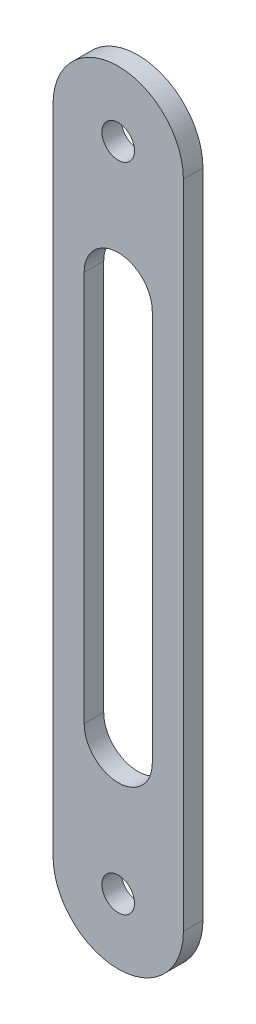
ISO-10303-21;
HEADER;
FILE_DESCRIPTION(('STEP AP214'),'2;1');
FILE_NAME('part.step','',(''),(''),'','','');
FILE_SCHEMA(('AUTOMOTIVE_DESIGN { 1 0 10303 214 1 1 1 1 }'));
ENDSEC;
DATA;
#1=APPLICATION_CONTEXT('core data for automotive mechanical design processes');
#2=APPLICATION_PROTOCOL_DEFINITION('international standard','automotive_design',2000,#1);
#3=PRODUCT_CONTEXT('',#1,'mechanical');
#4=PRODUCT('Part','Part','',(#3));
#5=PRODUCT_RELATED_PRODUCT_CATEGORY('part','',(#4));
#6=PRODUCT_DEFINITION_FORMATION('','',#4);
#7=PRODUCT_DEFINITION_CONTEXT('part definition',#1,'design');
#8=PRODUCT_DEFINITION('design','',#6,#7);
#9=PRODUCT_DEFINITION_SHAPE('','',#8);
#10=(LENGTH_UNIT() NAMED_UNIT(*) SI_UNIT(.MILLI.,.METRE.));
#11=(NAMED_UNIT(*) PLANE_ANGLE_UNIT() SI_UNIT($,.RADIAN.));
#12=(NAMED_UNIT(*) SI_UNIT($,.STERADIAN.) SOLID_ANGLE_UNIT());
#13=UNCERTAINTY_MEASURE_WITH_UNIT(LENGTH_MEASURE(1.E-05),#10,'distance_accuracy_value','');
#14=(GEOMETRIC_REPRESENTATION_CONTEXT(3) GLOBAL_UNCERTAINTY_ASSIGNED_CONTEXT((#13)) GLOBAL_UNIT_ASSIGNED_CONTEXT((#10,
#11,#12)) REPRESENTATION_CONTEXT('',''));
#15=CARTESIAN_POINT('',(0.,0.,0.));
#16=DIRECTION('',(0.,0.,1.));
#17=DIRECTION('',(1.,0.,0.));
#18=AXIS2_PLACEMENT_3D('',#15,#16,#17);
#19=CARTESIAN_POINT('',(0.,0.,3.));
#20=DIRECTION('',(0.,0.,1.));
#21=DIRECTION('',(1.,0.,0.));
#22=AXIS2_PLACEMENT_3D('',#19,#20,#21);
#23=PLANE('',#22);
#24=CARTESIAN_POINT('',(0.,-100.,3.));
#25=DIRECTION('',(0.,0.,1.));
#26=DIRECTION('',(1.,0.,0.));
#27=AXIS2_PLACEMENT_3D('',#24,#25,#26);
#28=CIRCLE('',#27,2.5);
#29=CARTESIAN_POINT('',(2.5,-100.,3.));
#30=VERTEX_POINT('',#29);
#31=EDGE_CURVE('E132',#30,#30,#28,.T.);
#32=ORIENTED_EDGE('',*,*,#31,.F.);
#33=EDGE_LOOP('',(#32));
#34=FACE_BOUND('',#33,.T.);
#35=CARTESIAN_POINT('',(0.,0.,3.));
#36=DIRECTION('',(0.,0.,1.));
#37=DIRECTION('',(1.,0.,0.));
#38=AXIS2_PLACEMENT_3D('',#35,#36,#37);
#39=CIRCLE('',#38,10.);
#40=CARTESIAN_POINT('',(10.,0.,3.));
#41=VERTEX_POINT('',#40);
#42=CARTESIAN_POINT('',(-10.,0.,3.));
#43=VERTEX_POINT('',#42);
#44=EDGE_CURVE('E144',#41,#43,#39,.T.);
#45=ORIENTED_EDGE('',*,*,#44,.T.);
#46=DIRECTION('',(0.,-1.,0.));
#47=VECTOR('',#46,1.);
#48=CARTESIAN_POINT('',(-10.,0.,3.));
#49=LINE('',#48,#47);
#50=CARTESIAN_POINT('',(-10.,-100.,3.));
#51=VERTEX_POINT('',#50);
#52=EDGE_CURVE('E147',#43,#51,#49,.T.);
#53=ORIENTED_EDGE('',*,*,#52,.T.);
#54=CARTESIAN_POINT('',(0.,-100.,3.));
#55=DIRECTION('',(0.,0.,1.));
#56=DIRECTION('',(1.,0.,0.));
#57=AXIS2_PLACEMENT_3D('',#54,#55,#56);
#58=CIRCLE('',#57,10.);
#59=CARTESIAN_POINT('',(10.,-100.,3.));
#60=VERTEX_POINT('',#59);
#61=EDGE_CURVE('E150',#51,#60,#58,.T.);
#62=ORIENTED_EDGE('',*,*,#61,.T.);
#63=DIRECTION('',(0.,1.,0.));
#64=VECTOR('',#63,1.);
#65=CARTESIAN_POINT('',(10.,0.,3.));
#66=LINE('',#65,#64);
#67=EDGE_CURVE('E152',#60,#41,#66,.T.);
#68=ORIENTED_EDGE('',*,*,#67,.T.);
#69=EDGE_LOOP('',(#45,#53,#62,#68));
#70=FACE_BOUND('',#69,.T.);
#71=CARTESIAN_POINT('',(0.,0.,3.));
#72=DIRECTION('',(0.,0.,1.));
#73=DIRECTION('',(1.,0.,0.));
#74=AXIS2_PLACEMENT_3D('',#71,#72,#73);
#75=CIRCLE('',#74,2.5);
#76=CARTESIAN_POINT('',(2.5,0.,3.));
#77=VERTEX_POINT('',#76);
#78=EDGE_CURVE('E138',#77,#77,#75,.T.);
#79=ORIENTED_EDGE('',*,*,#78,.F.);
#80=EDGE_LOOP('',(#79));
#81=FACE_BOUND('',#80,.T.);
#82=DIRECTION('',(0.,1.,0.));
#83=VECTOR('',#82,1.);
#84=CARTESIAN_POINT('',(5.22644240435807,-80.0000000000001,3.));
#85=LINE('',#84,#83);
#86=CARTESIAN_POINT('',(5.22644240435807,-80.0000000000001,3.));
#87=VERTEX_POINT('',#86);
#88=CARTESIAN_POINT('',(5.22644240435807,-20.,3.));
#89=VERTEX_POINT('',#88);
#90=EDGE_CURVE('E104',#87,#89,#85,.T.);
#91=ORIENTED_EDGE('',*,*,#90,.F.);
#92=CARTESIAN_POINT('',(0.,-80.0000000000001,3.));
#93=DIRECTION('',(0.,0.,1.));
#94=DIRECTION('',(1.,0.,0.));
#95=AXIS2_PLACEMENT_3D('',#92,#93,#94);
#96=CIRCLE('',#95,5.22644240435807);
#97=CARTESIAN_POINT('',(-5.22644240435807,-80.0000000000001,3.));
#98=VERTEX_POINT('',#97);
#99=EDGE_CURVE('E96',#98,#87,#96,.T.);
#100=ORIENTED_EDGE('',*,*,#99,.F.);
#101=DIRECTION('',(0.,-1.,0.));
#102=VECTOR('',#101,1.);
#103=CARTESIAN_POINT('',(-5.22644240435807,-80.0000000000001,3.));
#104=LINE('',#103,#102);
#105=CARTESIAN_POINT('',(-5.22644240435807,-20.,3.));
#106=VERTEX_POINT('',#105);
#107=EDGE_CURVE('E118',#106,#98,#104,.T.);
#108=ORIENTED_EDGE('',*,*,#107,.F.);
#109=CARTESIAN_POINT('',(0.,-20.,3.));
#110=DIRECTION('',(0.,0.,1.));
#111=DIRECTION('',(1.,0.,0.));
#112=AXIS2_PLACEMENT_3D('',#109,#110,#111);
#113=CIRCLE('',#112,5.22644240435807);
#114=EDGE_CURVE('E116',#89,#106,#113,.T.);
#115=ORIENTED_EDGE('',*,*,#114,.F.);
#116=EDGE_LOOP('',(#91,#100,#108,#115));
#117=FACE_BOUND('',#116,.T.);
#118=ADVANCED_FACE('F31',(#34,#70,#81,#117),#23,.T.);
#119=CARTESIAN_POINT('',(0.,0.,0.));
#120=DIRECTION('',(0.,0.,1.));
#121=DIRECTION('',(1.,0.,0.));
#122=AXIS2_PLACEMENT_3D('',#119,#120,#121);
#123=PLANE('',#122);
#124=CARTESIAN_POINT('',(0.,-100.,0.));
#125=DIRECTION('',(0.,0.,1.));
#126=DIRECTION('',(1.,0.,0.));
#127=AXIS2_PLACEMENT_3D('',#124,#125,#126);
#128=CIRCLE('',#127,2.5);
#129=CARTESIAN_POINT('',(2.5,-100.,0.));
#130=VERTEX_POINT('',#129);
#131=EDGE_CURVE('E112',#130,#130,#128,.T.);
#132=ORIENTED_EDGE('',*,*,#131,.T.);
#133=EDGE_LOOP('',(#132));
#134=FACE_BOUND('',#133,.T.);
#135=CARTESIAN_POINT('',(0.,0.,0.));
#136=DIRECTION('',(0.,0.,1.));
#137=DIRECTION('',(1.,0.,0.));
#138=AXIS2_PLACEMENT_3D('',#135,#136,#137);
#139=CIRCLE('',#138,10.);
#140=CARTESIAN_POINT('',(10.,0.,0.));
#141=VERTEX_POINT('',#140);
#142=CARTESIAN_POINT('',(-10.,0.,0.));
#143=VERTEX_POINT('',#142);
#144=EDGE_CURVE('E141',#141,#143,#139,.T.);
#145=ORIENTED_EDGE('',*,*,#144,.F.);
#146=DIRECTION('',(0.,1.,0.));
#147=VECTOR('',#146,1.);
#148=CARTESIAN_POINT('',(10.,0.,0.));
#149=LINE('',#148,#147);
#150=CARTESIAN_POINT('',(10.,-100.,0.));
#151=VERTEX_POINT('',#150);
#152=EDGE_CURVE('E148',#151,#141,#149,.T.);
#153=ORIENTED_EDGE('',*,*,#152,.F.);
#154=CARTESIAN_POINT('',(0.,-100.,0.));
#155=DIRECTION('',(0.,0.,1.));
#156=DIRECTION('',(1.,0.,0.));
#157=AXIS2_PLACEMENT_3D('',#154,#155,#156);
#158=CIRCLE('',#157,10.);
#159=CARTESIAN_POINT('',(-10.,-100.,0.));
#160=VERTEX_POINT('',#159);
#161=EDGE_CURVE('E159',#160,#151,#158,.T.);
#162=ORIENTED_EDGE('',*,*,#161,.F.);
#163=DIRECTION('',(0.,-1.,0.));
#164=VECTOR('',#163,1.);
#165=CARTESIAN_POINT('',(-10.,0.,0.));
#166=LINE('',#165,#164);
#167=EDGE_CURVE('E157',#143,#160,#166,.T.);
#168=ORIENTED_EDGE('',*,*,#167,.F.);
#169=EDGE_LOOP('',(#145,#153,#162,#168));
#170=FACE_BOUND('',#169,.T.);
#171=CARTESIAN_POINT('',(0.,0.,0.));
#172=DIRECTION('',(0.,0.,1.));
#173=DIRECTION('',(1.,0.,0.));
#174=AXIS2_PLACEMENT_3D('',#171,#172,#173);
#175=CIRCLE('',#174,2.5);
#176=CARTESIAN_POINT('',(2.5,0.,0.));
#177=VERTEX_POINT('',#176);
#178=EDGE_CURVE('E135',#177,#177,#175,.T.);
#179=ORIENTED_EDGE('',*,*,#178,.T.);
#180=EDGE_LOOP('',(#179));
#181=FACE_BOUND('',#180,.T.);
#182=CARTESIAN_POINT('',(0.,-80.0000000000001,0.));
#183=DIRECTION('',(0.,0.,1.));
#184=DIRECTION('',(1.,0.,0.));
#185=AXIS2_PLACEMENT_3D('',#182,#183,#184);
#186=CIRCLE('',#185,5.22644240435807);
#187=CARTESIAN_POINT('',(-5.22644240435807,-80.0000000000001,0.));
#188=VERTEX_POINT('',#187);
#189=CARTESIAN_POINT('',(5.22644240435807,-80.0000000000001,0.));
#190=VERTEX_POINT('',#189);
#191=EDGE_CURVE('E54',#188,#190,#186,.T.);
#192=ORIENTED_EDGE('',*,*,#191,.T.);
#193=DIRECTION('',(0.,1.,0.));
#194=VECTOR('',#193,1.);
#195=CARTESIAN_POINT('',(5.22644240435807,-80.0000000000001,0.));
#196=LINE('',#195,#194);
#197=CARTESIAN_POINT('',(5.22644240435807,-20.,0.));
#198=VERTEX_POINT('',#197);
#199=EDGE_CURVE('E111',#190,#198,#196,.T.);
#200=ORIENTED_EDGE('',*,*,#199,.T.);
#201=CARTESIAN_POINT('',(0.,-20.,0.));
#202=DIRECTION('',(0.,0.,1.));
#203=DIRECTION('',(1.,0.,0.));
#204=AXIS2_PLACEMENT_3D('',#201,#202,#203);
#205=CIRCLE('',#204,5.22644240435807);
#206=CARTESIAN_POINT('',(-5.22644240435807,-20.,0.));
#207=VERTEX_POINT('',#206);
#208=EDGE_CURVE('E124',#198,#207,#205,.T.);
#209=ORIENTED_EDGE('',*,*,#208,.T.);
#210=DIRECTION('',(0.,-1.,0.));
#211=VECTOR('',#210,1.);
#212=CARTESIAN_POINT('',(-5.22644240435807,-80.0000000000001,0.));
#213=LINE('',#212,#211);
#214=EDGE_CURVE('E105',#207,#188,#213,.T.);
#215=ORIENTED_EDGE('',*,*,#214,.T.);
#216=EDGE_LOOP('',(#192,#200,#209,#215));
#217=FACE_BOUND('',#216,.T.);
#218=ADVANCED_FACE('F177',(#134,#170,#181,#217),#123,.F.);
#219=CARTESIAN_POINT('',(0.,0.,3.));
#220=DIRECTION('',(0.,0.,-1.));
#221=DIRECTION('',(-1.,0.,0.));
#222=AXIS2_PLACEMENT_3D('',#219,#220,#221);
#223=CYLINDRICAL_SURFACE('',#222,10.);
#224=ORIENTED_EDGE('',*,*,#144,.T.);
#225=DIRECTION('',(0.,0.,-1.));
#226=VECTOR('',#225,1.);
#227=CARTESIAN_POINT('',(-10.,0.,3.));
#228=LINE('',#227,#226);
#229=EDGE_CURVE('E11',#43,#143,#228,.T.);
#230=ORIENTED_EDGE('',*,*,#229,.F.);
#231=ORIENTED_EDGE('',*,*,#44,.F.);
#232=DIRECTION('',(0.,0.,-1.));
#233=VECTOR('',#232,1.);
#234=CARTESIAN_POINT('',(10.,0.,3.));
#235=LINE('',#234,#233);
#236=EDGE_CURVE('E154',#41,#141,#235,.T.);
#237=ORIENTED_EDGE('',*,*,#236,.T.);
#238=EDGE_LOOP('',(#224,#230,#231,#237));
#239=FACE_BOUND('',#238,.T.);
#240=ADVANCED_FACE('F33',(#239),#223,.T.);
#241=CARTESIAN_POINT('',(-10.,0.,3.));
#242=DIRECTION('',(1.,0.,0.));
#243=DIRECTION('',(0.,1.,0.));
#244=AXIS2_PLACEMENT_3D('',#241,#242,#243);
#245=PLANE('',#244);
#246=ORIENTED_EDGE('',*,*,#167,.T.);
#247=DIRECTION('',(0.,0.,-1.));
#248=VECTOR('',#247,1.);
#249=CARTESIAN_POINT('',(-10.,-100.,3.));
#250=LINE('',#249,#248);
#251=EDGE_CURVE('E39',#51,#160,#250,.T.);
#252=ORIENTED_EDGE('',*,*,#251,.F.);
#253=ORIENTED_EDGE('',*,*,#52,.F.);
#254=ORIENTED_EDGE('',*,*,#229,.T.);
#255=EDGE_LOOP('',(#246,#252,#253,#254));
#256=FACE_BOUND('',#255,.T.);
#257=ADVANCED_FACE('F188',(#256),#245,.F.);
#258=CARTESIAN_POINT('',(0.,-100.,3.));
#259=DIRECTION('',(0.,0.,-1.));
#260=DIRECTION('',(-1.,0.,0.));
#261=AXIS2_PLACEMENT_3D('',#258,#259,#260);
#262=CYLINDRICAL_SURFACE('',#261,10.);
#263=ORIENTED_EDGE('',*,*,#161,.T.);
#264=DIRECTION('',(0.,0.,-1.));
#265=VECTOR('',#264,1.);
#266=CARTESIAN_POINT('',(10.,-100.,3.));
#267=LINE('',#266,#265);
#268=EDGE_CURVE('E164',#60,#151,#267,.T.);
#269=ORIENTED_EDGE('',*,*,#268,.F.);
#270=ORIENTED_EDGE('',*,*,#61,.F.);
#271=ORIENTED_EDGE('',*,*,#251,.T.);
#272=EDGE_LOOP('',(#263,#269,#270,#271));
#273=FACE_BOUND('',#272,.T.);
#274=ADVANCED_FACE('F171',(#273),#262,.T.);
#275=CARTESIAN_POINT('',(10.,0.,3.));
#276=DIRECTION('',(-1.,0.,0.));
#277=DIRECTION('',(0.,-1.,0.));
#278=AXIS2_PLACEMENT_3D('',#275,#276,#277);
#279=PLANE('',#278);
#280=ORIENTED_EDGE('',*,*,#152,.T.);
#281=ORIENTED_EDGE('',*,*,#236,.F.);
#282=ORIENTED_EDGE('',*,*,#67,.F.);
#283=ORIENTED_EDGE('',*,*,#268,.T.);
#284=EDGE_LOOP('',(#280,#281,#282,#283));
#285=FACE_BOUND('',#284,.T.);
#286=ADVANCED_FACE('F181',(#285),#279,.F.);
#287=CARTESIAN_POINT('',(0.,0.,3.));
#288=DIRECTION('',(0.,0.,-1.));
#289=DIRECTION('',(-1.,0.,0.));
#290=AXIS2_PLACEMENT_3D('',#287,#288,#289);
#291=CYLINDRICAL_SURFACE('',#290,2.5);
#292=ORIENTED_EDGE('',*,*,#78,.T.);
#293=EDGE_LOOP('',(#292));
#294=FACE_BOUND('',#293,.T.);
#295=ORIENTED_EDGE('',*,*,#178,.F.);
#296=EDGE_LOOP('',(#295));
#297=FACE_BOUND('',#296,.T.);
#298=ADVANCED_FACE('F205',(#294,#297),#291,.F.);
#299=CARTESIAN_POINT('',(0.,-100.,3.));
#300=DIRECTION('',(0.,0.,-1.));
#301=DIRECTION('',(-1.,0.,0.));
#302=AXIS2_PLACEMENT_3D('',#299,#300,#301);
#303=CYLINDRICAL_SURFACE('',#302,2.5);
#304=ORIENTED_EDGE('',*,*,#31,.T.);
#305=EDGE_LOOP('',(#304));
#306=FACE_BOUND('',#305,.T.);
#307=ORIENTED_EDGE('',*,*,#131,.F.);
#308=EDGE_LOOP('',(#307));
#309=FACE_BOUND('',#308,.T.);
#310=ADVANCED_FACE('F212',(#306,#309),#303,.F.);
#311=CARTESIAN_POINT('',(0.,-80.0000000000001,3.));
#312=DIRECTION('',(0.,0.,-1.));
#313=DIRECTION('',(-1.,0.,0.));
#314=AXIS2_PLACEMENT_3D('',#311,#312,#313);
#315=CYLINDRICAL_SURFACE('',#314,5.22644240435807);
#316=ORIENTED_EDGE('',*,*,#191,.F.);
#317=DIRECTION('',(0.,0.,-1.));
#318=VECTOR('',#317,1.);
#319=CARTESIAN_POINT('',(-5.22644240435807,-80.0000000000001,3.));
#320=LINE('',#319,#318);
#321=EDGE_CURVE('E100',#98,#188,#320,.T.);
#322=ORIENTED_EDGE('',*,*,#321,.F.);
#323=ORIENTED_EDGE('',*,*,#99,.T.);
#324=DIRECTION('',(0.,0.,-1.));
#325=VECTOR('',#324,1.);
#326=CARTESIAN_POINT('',(5.22644240435807,-80.0000000000001,3.));
#327=LINE('',#326,#325);
#328=EDGE_CURVE('E99',#87,#190,#327,.T.);
#329=ORIENTED_EDGE('',*,*,#328,.T.);
#330=EDGE_LOOP('',(#316,#322,#323,#329));
#331=FACE_BOUND('',#330,.T.);
#332=ADVANCED_FACE('F98',(#331),#315,.F.);
#333=CARTESIAN_POINT('',(5.22644240435807,-80.0000000000001,3.));
#334=DIRECTION('',(-1.,0.,0.));
#335=DIRECTION('',(0.,0.,1.));
#336=AXIS2_PLACEMENT_3D('',#333,#334,#335);
#337=PLANE('',#336);
#338=ORIENTED_EDGE('',*,*,#199,.F.);
#339=ORIENTED_EDGE('',*,*,#328,.F.);
#340=ORIENTED_EDGE('',*,*,#90,.T.);
#341=DIRECTION('',(0.,0.,-1.));
#342=VECTOR('',#341,1.);
#343=CARTESIAN_POINT('',(5.22644240435807,-20.,3.));
#344=LINE('',#343,#342);
#345=EDGE_CURVE('E113',#89,#198,#344,.T.);
#346=ORIENTED_EDGE('',*,*,#345,.T.);
#347=EDGE_LOOP('',(#338,#339,#340,#346));
#348=FACE_BOUND('',#347,.T.);
#349=ADVANCED_FACE('F108',(#348),#337,.T.);
#350=CARTESIAN_POINT('',(0.,-20.,3.));
#351=DIRECTION('',(0.,0.,-1.));
#352=DIRECTION('',(-1.,0.,0.));
#353=AXIS2_PLACEMENT_3D('',#350,#351,#352);
#354=CYLINDRICAL_SURFACE('',#353,5.22644240435807);
#355=ORIENTED_EDGE('',*,*,#208,.F.);
#356=ORIENTED_EDGE('',*,*,#345,.F.);
#357=ORIENTED_EDGE('',*,*,#114,.T.);
#358=DIRECTION('',(0.,0.,-1.));
#359=VECTOR('',#358,1.);
#360=CARTESIAN_POINT('',(-5.22644240435807,-20.,3.));
#361=LINE('',#360,#359);
#362=EDGE_CURVE('E46',#106,#207,#361,.T.);
#363=ORIENTED_EDGE('',*,*,#362,.T.);
#364=EDGE_LOOP('',(#355,#356,#357,#363));
#365=FACE_BOUND('',#364,.T.);
#366=ADVANCED_FACE('F225',(#365),#354,.F.);
#367=CARTESIAN_POINT('',(-5.22644240435807,-80.0000000000001,3.));
#368=DIRECTION('',(1.,0.,0.));
#369=DIRECTION('',(0.,0.,-1.));
#370=AXIS2_PLACEMENT_3D('',#367,#368,#369);
#371=PLANE('',#370);
#372=ORIENTED_EDGE('',*,*,#214,.F.);
#373=ORIENTED_EDGE('',*,*,#362,.F.);
#374=ORIENTED_EDGE('',*,*,#107,.T.);
#375=ORIENTED_EDGE('',*,*,#321,.T.);
#376=EDGE_LOOP('',(#372,#373,#374,#375));
#377=FACE_BOUND('',#376,.T.);
#378=ADVANCED_FACE('F223',(#377),#371,.T.);
#379=CLOSED_SHELL('',(#118,#218,#240,#257,#274,#286,#298,#310,#332,#349,#366,#378));
#380=MANIFOLD_SOLID_BREP('B2',#379);
#381=ADVANCED_BREP_SHAPE_REPRESENTATION('',(#18,#380),#14);
#382=SHAPE_DEFINITION_REPRESENTATION(#9,#381);
ENDSEC;
END-ISO-10303-21;
